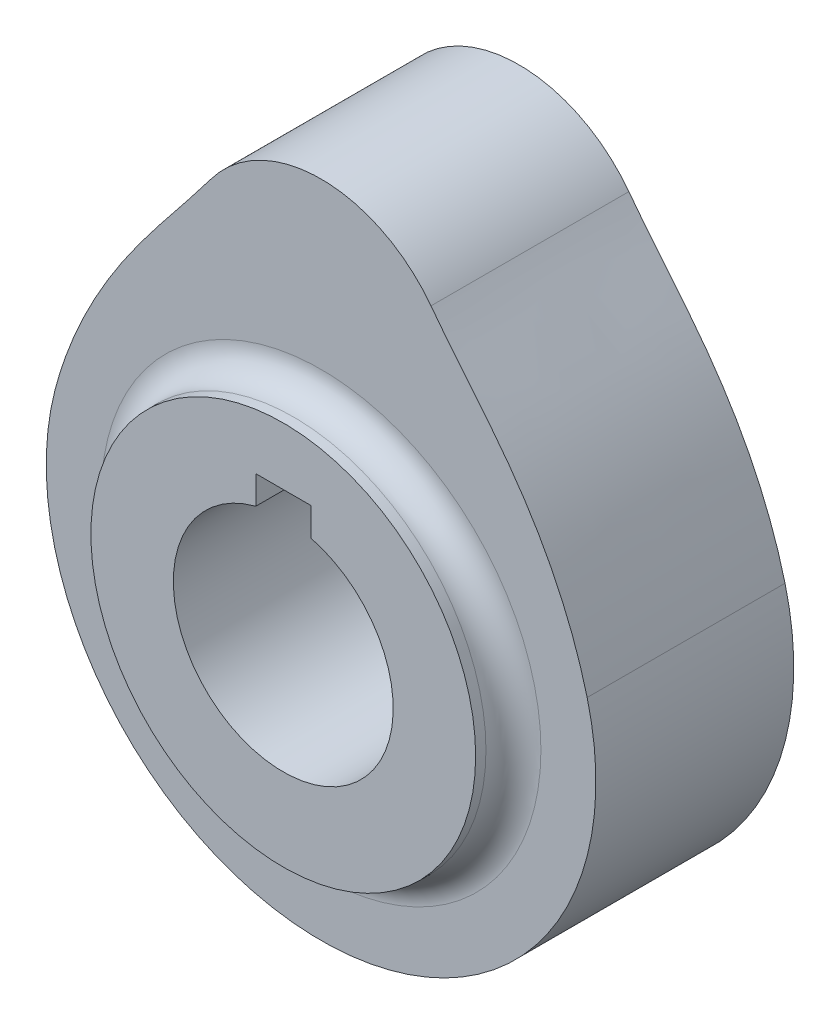
ISO-10303-21;
HEADER;
FILE_DESCRIPTION(('STEP AP214'),'2;1');
FILE_NAME('part.step','',(''),(''),'','','');
FILE_SCHEMA(('AUTOMOTIVE_DESIGN { 1 0 10303 214 1 1 1 1 }'));
ENDSEC;
DATA;
#1=APPLICATION_CONTEXT('core data for automotive mechanical design processes');
#2=APPLICATION_PROTOCOL_DEFINITION('international standard','automotive_design',2000,#1);
#3=PRODUCT_CONTEXT('',#1,'mechanical');
#4=PRODUCT('Part','Part','',(#3));
#5=PRODUCT_RELATED_PRODUCT_CATEGORY('part','',(#4));
#6=PRODUCT_DEFINITION_FORMATION('','',#4);
#7=PRODUCT_DEFINITION_CONTEXT('part definition',#1,'design');
#8=PRODUCT_DEFINITION('design','',#6,#7);
#9=PRODUCT_DEFINITION_SHAPE('','',#8);
#10=(LENGTH_UNIT() NAMED_UNIT(*) SI_UNIT(.MILLI.,.METRE.));
#11=(NAMED_UNIT(*) PLANE_ANGLE_UNIT() SI_UNIT($,.RADIAN.));
#12=(NAMED_UNIT(*) SI_UNIT($,.STERADIAN.) SOLID_ANGLE_UNIT());
#13=UNCERTAINTY_MEASURE_WITH_UNIT(LENGTH_MEASURE(1.E-05),#10,'distance_accuracy_value','');
#14=(GEOMETRIC_REPRESENTATION_CONTEXT(3) GLOBAL_UNCERTAINTY_ASSIGNED_CONTEXT((#13)) GLOBAL_UNIT_ASSIGNED_CONTEXT((#10,
#11,#12)) REPRESENTATION_CONTEXT('',''));
#15=CARTESIAN_POINT('',(0.,0.,0.));
#16=DIRECTION('',(0.,0.,1.));
#17=DIRECTION('',(1.,0.,0.));
#18=AXIS2_PLACEMENT_3D('',#15,#16,#17);
#19=CARTESIAN_POINT('',(-14.7328030515928,15.1288871038017,14.4));
#20=DIRECTION('',(0.,0.,1.));
#21=DIRECTION('',(1.,0.,0.));
#22=AXIS2_PLACEMENT_3D('',#19,#20,#21);
#23=PLANE('',#22);
#24=CARTESIAN_POINT('',(0.,0.,14.4));
#25=DIRECTION('',(0.,0.,1.));
#26=DIRECTION('',(1.,0.,0.));
#27=AXIS2_PLACEMENT_3D('',#24,#25,#26);
#28=CIRCLE('',#27,16.);
#29=CARTESIAN_POINT('',(16.,0.,14.4));
#30=VERTEX_POINT('',#29);
#31=EDGE_CURVE('E388',#30,#30,#28,.F.);
#32=ORIENTED_EDGE('',*,*,#31,.T.);
#33=EDGE_LOOP('',(#32));
#34=FACE_BOUND('',#33,.T.);
#35=CARTESIAN_POINT('',(-8.,24.,14.4));
#36=CARTESIAN_POINT('',(-9.88576361491472,21.485648513447,14.4));
#37=CARTESIAN_POINT('',(-14.7683469225071,15.8742453691268,14.4));
#38=CARTESIAN_POINT('',(-18.2976031188135,9.13368784532233,14.4));
#39=CARTESIAN_POINT('',(-19.3649167310371,5.,14.4));
#40=B_SPLINE_CURVE_WITH_KNOTS('',3,(#35,#36,#37,#38,#39),.UNSPECIFIED.,.F.,.F.,(4,1,4),(0.,
0.425985113809563,1.),.UNSPECIFIED.);
#41=CARTESIAN_POINT('',(-8.,24.,14.4));
#42=VERTEX_POINT('',#41);
#43=CARTESIAN_POINT('',(-19.3649167310371,5.,14.4));
#44=VERTEX_POINT('',#43);
#45=EDGE_CURVE('E161',#42,#44,#40,.T.);
#46=ORIENTED_EDGE('',*,*,#45,.T.);
#47=CARTESIAN_POINT('',(0.,0.,14.4));
#48=DIRECTION('',(0.,0.,1.));
#49=DIRECTION('',(-1.,0.,0.));
#50=AXIS2_PLACEMENT_3D('',#47,#48,#49);
#51=CIRCLE('',#50,20.);
#52=CARTESIAN_POINT('',(19.3649167310371,5.,14.4));
#53=VERTEX_POINT('',#52);
#54=EDGE_CURVE('E166',#44,#53,#51,.T.);
#55=ORIENTED_EDGE('',*,*,#54,.T.);
#56=CARTESIAN_POINT('',(19.3649167310371,5.,14.4));
#57=CARTESIAN_POINT('',(18.2287803940844,9.40023711203882,14.4));
#58=CARTESIAN_POINT('',(14.8352698556782,16.0327110814742,14.4));
#59=CARTESIAN_POINT('',(9.9746206812277,21.3671724250297,14.4));
#60=CARTESIAN_POINT('',(8.,24.,14.4));
#61=B_SPLINE_CURVE_WITH_KNOTS('',3,(#56,#57,#58,#59,#60),.UNSPECIFIED.,.F.,.F.,(4,1,4),(0.,
0.579854245128984,1.),.UNSPECIFIED.);
#62=CARTESIAN_POINT('',(8.,24.,14.4));
#63=VERTEX_POINT('',#62);
#64=EDGE_CURVE('E171',#53,#63,#61,.T.);
#65=ORIENTED_EDGE('',*,*,#64,.T.);
#66=CARTESIAN_POINT('',(0.,18.,14.4));
#67=DIRECTION('',(0.,0.,1.));
#68=DIRECTION('',(1.,0.,0.));
#69=AXIS2_PLACEMENT_3D('',#66,#67,#68);
#70=CIRCLE('',#69,10.);
#71=EDGE_CURVE('E60',#63,#42,#70,.T.);
#72=ORIENTED_EDGE('',*,*,#71,.T.);
#73=EDGE_LOOP('',(#46,#55,#65,#72));
#74=FACE_BOUND('',#73,.T.);
#75=ADVANCED_FACE('F36',(#34,#74),#23,.T.);
#76=CARTESIAN_POINT('',(-14.7328030515928,15.1288871038017,0.));
#77=DIRECTION('',(0.,0.,1.));
#78=DIRECTION('',(1.,0.,0.));
#79=AXIS2_PLACEMENT_3D('',#76,#77,#78);
#80=PLANE('',#79);
#81=CARTESIAN_POINT('',(0.,0.,0.));
#82=DIRECTION('',(0.,0.,1.));
#83=DIRECTION('',(1.,0.,0.));
#84=AXIS2_PLACEMENT_3D('',#81,#82,#83);
#85=CIRCLE('',#84,16.);
#86=CARTESIAN_POINT('',(16.,0.,0.));
#87=VERTEX_POINT('',#86);
#88=EDGE_CURVE('E381',#87,#87,#85,.T.);
#89=ORIENTED_EDGE('',*,*,#88,.T.);
#90=EDGE_LOOP('',(#89));
#91=FACE_BOUND('',#90,.T.);
#92=CARTESIAN_POINT('',(-8.,24.,0.));
#93=CARTESIAN_POINT('',(-9.88576361491472,21.485648513447,0.));
#94=CARTESIAN_POINT('',(-14.7683469225071,15.8742453691268,0.));
#95=CARTESIAN_POINT('',(-18.2976031188135,9.13368784532233,0.));
#96=CARTESIAN_POINT('',(-19.3649167310371,5.,0.));
#97=B_SPLINE_CURVE_WITH_KNOTS('',3,(#92,#93,#94,#95,#96),.UNSPECIFIED.,.F.,.F.,(4,1,4),(0.,
0.425985113809563,1.),.UNSPECIFIED.);
#98=CARTESIAN_POINT('',(-8.,24.,0.));
#99=VERTEX_POINT('',#98);
#100=CARTESIAN_POINT('',(-19.3649167310371,5.,0.));
#101=VERTEX_POINT('',#100);
#102=EDGE_CURVE('E143',#99,#101,#97,.T.);
#103=ORIENTED_EDGE('',*,*,#102,.F.);
#104=CARTESIAN_POINT('',(0.,18.,0.));
#105=DIRECTION('',(0.,0.,1.));
#106=DIRECTION('',(1.,0.,0.));
#107=AXIS2_PLACEMENT_3D('',#104,#105,#106);
#108=CIRCLE('',#107,10.);
#109=CARTESIAN_POINT('',(8.,24.,0.));
#110=VERTEX_POINT('',#109);
#111=EDGE_CURVE('E157',#110,#99,#108,.T.);
#112=ORIENTED_EDGE('',*,*,#111,.F.);
#113=CARTESIAN_POINT('',(19.3649167310371,5.,0.));
#114=CARTESIAN_POINT('',(18.2287803940844,9.40023711203882,0.));
#115=CARTESIAN_POINT('',(14.8352698556782,16.0327110814742,0.));
#116=CARTESIAN_POINT('',(9.9746206812277,21.3671724250297,0.));
#117=CARTESIAN_POINT('',(8.,24.,0.));
#118=B_SPLINE_CURVE_WITH_KNOTS('',3,(#113,#114,#115,#116,#117),.UNSPECIFIED.,.F.,.F.,(4,1,4),
(0.,0.579854245128984,1.),.UNSPECIFIED.);
#119=CARTESIAN_POINT('',(19.3649167310371,5.,0.));
#120=VERTEX_POINT('',#119);
#121=EDGE_CURVE('E153',#120,#110,#118,.T.);
#122=ORIENTED_EDGE('',*,*,#121,.F.);
#123=CARTESIAN_POINT('',(0.,0.,0.));
#124=DIRECTION('',(0.,0.,1.));
#125=DIRECTION('',(-1.,0.,0.));
#126=AXIS2_PLACEMENT_3D('',#123,#124,#125);
#127=CIRCLE('',#126,20.);
#128=EDGE_CURVE('E148',#101,#120,#127,.T.);
#129=ORIENTED_EDGE('',*,*,#128,.F.);
#130=EDGE_LOOP('',(#103,#112,#122,#129));
#131=FACE_BOUND('',#130,.T.);
#132=ADVANCED_FACE('F193',(#91,#131),#80,.F.);
#133=DIRECTION('',(0.,0.,-1.));
#134=VECTOR('',#133,1.);
#135=SURFACE_OF_LINEAR_EXTRUSION('',#40,#134);
#136=ORIENTED_EDGE('',*,*,#102,.T.);
#137=DIRECTION('',(0.,0.,-1.));
#138=VECTOR('',#137,1.);
#139=CARTESIAN_POINT('',(-19.3649167310371,5.,14.4));
#140=LINE('',#139,#138);
#141=EDGE_CURVE('E376',#44,#101,#140,.T.);
#142=ORIENTED_EDGE('',*,*,#141,.F.);
#143=ORIENTED_EDGE('',*,*,#45,.F.);
#144=DIRECTION('',(0.,0.,-1.));
#145=VECTOR('',#144,1.);
#146=CARTESIAN_POINT('',(-8.,24.,14.4));
#147=LINE('',#146,#145);
#148=EDGE_CURVE('E365',#42,#99,#147,.T.);
#149=ORIENTED_EDGE('',*,*,#148,.T.);
#150=EDGE_LOOP('',(#136,#142,#143,#149));
#151=FACE_BOUND('',#150,.T.);
#152=ADVANCED_FACE('F38',(#151),#135,.F.);
#153=CARTESIAN_POINT('',(0.,0.,14.4));
#154=DIRECTION('',(0.,0.,-1.));
#155=DIRECTION('',(-1.,0.,0.));
#156=AXIS2_PLACEMENT_3D('',#153,#154,#155);
#157=CYLINDRICAL_SURFACE('',#156,20.);
#158=ORIENTED_EDGE('',*,*,#128,.T.);
#159=DIRECTION('',(0.,0.,-1.));
#160=VECTOR('',#159,1.);
#161=CARTESIAN_POINT('',(19.3649167310371,5.,14.4));
#162=LINE('',#161,#160);
#163=EDGE_CURVE('E378',#53,#120,#162,.T.);
#164=ORIENTED_EDGE('',*,*,#163,.F.);
#165=ORIENTED_EDGE('',*,*,#54,.F.);
#166=ORIENTED_EDGE('',*,*,#141,.T.);
#167=EDGE_LOOP('',(#158,#164,#165,#166));
#168=FACE_BOUND('',#167,.T.);
#169=ADVANCED_FACE('F185',(#168),#157,.T.);
#170=DIRECTION('',(0.,0.,-1.));
#171=VECTOR('',#170,1.);
#172=SURFACE_OF_LINEAR_EXTRUSION('',#61,#171);
#173=ORIENTED_EDGE('',*,*,#121,.T.);
#174=DIRECTION('',(0.,0.,-1.));
#175=VECTOR('',#174,1.);
#176=CARTESIAN_POINT('',(8.,24.,14.4));
#177=LINE('',#176,#175);
#178=EDGE_CURVE('E368',#63,#110,#177,.T.);
#179=ORIENTED_EDGE('',*,*,#178,.F.);
#180=ORIENTED_EDGE('',*,*,#64,.F.);
#181=ORIENTED_EDGE('',*,*,#163,.T.);
#182=EDGE_LOOP('',(#173,#179,#180,#181));
#183=FACE_BOUND('',#182,.T.);
#184=ADVANCED_FACE('F181',(#183),#172,.F.);
#185=CARTESIAN_POINT('',(0.,18.,14.4));
#186=DIRECTION('',(0.,0.,-1.));
#187=DIRECTION('',(-1.,0.,0.));
#188=AXIS2_PLACEMENT_3D('',#185,#186,#187);
#189=CYLINDRICAL_SURFACE('',#188,10.);
#190=ORIENTED_EDGE('',*,*,#111,.T.);
#191=ORIENTED_EDGE('',*,*,#148,.F.);
#192=ORIENTED_EDGE('',*,*,#71,.F.);
#193=ORIENTED_EDGE('',*,*,#178,.T.);
#194=EDGE_LOOP('',(#190,#191,#192,#193));
#195=FACE_BOUND('',#194,.T.);
#196=ADVANCED_FACE('F184',(#195),#189,.T.);
#197=CARTESIAN_POINT('',(0.,0.,-2.85));
#198=DIRECTION('',(0.,0.,1.));
#199=DIRECTION('',(1.,0.,0.));
#200=AXIS2_PLACEMENT_3D('',#197,#198,#199);
#201=PLANE('',#200);
#202=DIRECTION('',(-1.,0.,0.));
#203=VECTOR('',#202,1.);
#204=CARTESIAN_POINT('',(-2.,9.8,-2.85));
#205=LINE('',#204,#203);
#206=CARTESIAN_POINT('',(2.,9.8,-2.85));
#207=VERTEX_POINT('',#206);
#208=CARTESIAN_POINT('',(-2.,9.8,-2.85));
#209=VERTEX_POINT('',#208);
#210=EDGE_CURVE('E118',#207,#209,#205,.T.);
#211=ORIENTED_EDGE('',*,*,#210,.T.);
#212=DIRECTION('',(0.,-1.,0.));
#213=VECTOR('',#212,1.);
#214=CARTESIAN_POINT('',(-2.,4.8,-2.85));
#215=LINE('',#214,#213);
#216=CARTESIAN_POINT('',(-2.,7.74596669241483,-2.85));
#217=VERTEX_POINT('',#216);
#218=EDGE_CURVE('E123',#209,#217,#215,.T.);
#219=ORIENTED_EDGE('',*,*,#218,.T.);
#220=CARTESIAN_POINT('',(0.,0.,-2.85));
#221=DIRECTION('',(0.,0.,1.));
#222=DIRECTION('',(1.,0.,0.));
#223=AXIS2_PLACEMENT_3D('',#220,#221,#222);
#224=CIRCLE('',#223,8.);
#225=CARTESIAN_POINT('',(2.,7.74596669241483,-2.85));
#226=VERTEX_POINT('',#225);
#227=EDGE_CURVE('E134',#217,#226,#224,.T.);
#228=ORIENTED_EDGE('',*,*,#227,.T.);
#229=DIRECTION('',(0.,1.,0.));
#230=VECTOR('',#229,1.);
#231=CARTESIAN_POINT('',(2.,4.8,-2.85));
#232=LINE('',#231,#230);
#233=EDGE_CURVE('E52',#226,#207,#232,.T.);
#234=ORIENTED_EDGE('',*,*,#233,.T.);
#235=EDGE_LOOP('',(#211,#219,#228,#234));
#236=FACE_BOUND('',#235,.T.);
#237=CARTESIAN_POINT('',(0.,0.,-2.85));
#238=DIRECTION('',(0.,0.,1.));
#239=DIRECTION('',(1.,0.,0.));
#240=AXIS2_PLACEMENT_3D('',#237,#238,#239);
#241=CIRCLE('',#240,14.);
#242=CARTESIAN_POINT('',(14.,0.,-2.85));
#243=VERTEX_POINT('',#242);
#244=EDGE_CURVE('E137',#243,#243,#241,.T.);
#245=ORIENTED_EDGE('',*,*,#244,.F.);
#246=EDGE_LOOP('',(#245));
#247=FACE_BOUND('',#246,.T.);
#248=ADVANCED_FACE('F212',(#236,#247),#201,.F.);
#249=CARTESIAN_POINT('',(0.,0.,17.15));
#250=DIRECTION('',(0.,0.,-1.));
#251=DIRECTION('',(-1.,0.,0.));
#252=AXIS2_PLACEMENT_3D('',#249,#250,#251);
#253=CYLINDRICAL_SURFACE('',#252,14.);
#254=CARTESIAN_POINT('',(0.,0.,-2.));
#255=DIRECTION('',(0.,0.,1.));
#256=DIRECTION('',(1.,0.,0.));
#257=AXIS2_PLACEMENT_3D('',#254,#255,#256);
#258=CIRCLE('',#257,14.);
#259=CARTESIAN_POINT('',(14.,0.,-2.));
#260=VERTEX_POINT('',#259);
#261=EDGE_CURVE('E377',#260,#260,#258,.F.);
#262=ORIENTED_EDGE('',*,*,#261,.T.);
#263=EDGE_LOOP('',(#262));
#264=FACE_BOUND('',#263,.T.);
#265=ORIENTED_EDGE('',*,*,#244,.T.);
#266=EDGE_LOOP('',(#265));
#267=FACE_BOUND('',#266,.T.);
#268=ADVANCED_FACE('F207',(#264,#267),#253,.T.);
#269=CARTESIAN_POINT('',(0.,0.,16.4));
#270=DIRECTION('',(0.,0.,1.));
#271=DIRECTION('',(1.,0.,0.));
#272=AXIS2_PLACEMENT_3D('',#269,#270,#271);
#273=CIRCLE('',#272,14.);
#274=CARTESIAN_POINT('',(14.,0.,16.4));
#275=VERTEX_POINT('',#274);
#276=EDGE_CURVE('E390',#275,#275,#273,.T.);
#277=ORIENTED_EDGE('',*,*,#276,.T.);
#278=EDGE_LOOP('',(#277));
#279=FACE_BOUND('',#278,.T.);
#280=CARTESIAN_POINT('',(0.,0.,17.15));
#281=DIRECTION('',(0.,0.,1.));
#282=DIRECTION('',(1.,0.,0.));
#283=AXIS2_PLACEMENT_3D('',#280,#281,#282);
#284=CIRCLE('',#283,14.);
#285=CARTESIAN_POINT('',(14.,0.,17.15));
#286=VERTEX_POINT('',#285);
#287=EDGE_CURVE('E140',#286,#286,#284,.T.);
#288=ORIENTED_EDGE('',*,*,#287,.F.);
#289=EDGE_LOOP('',(#288));
#290=FACE_BOUND('',#289,.T.);
#291=ADVANCED_FACE('F204',(#279,#290),#253,.T.);
#292=CARTESIAN_POINT('',(0.,0.,17.15));
#293=DIRECTION('',(0.,0.,1.));
#294=DIRECTION('',(1.,0.,0.));
#295=AXIS2_PLACEMENT_3D('',#292,#293,#294);
#296=PLANE('',#295);
#297=DIRECTION('',(0.,-1.,0.));
#298=VECTOR('',#297,1.);
#299=CARTESIAN_POINT('',(-2.,4.8,17.15));
#300=LINE('',#299,#298);
#301=CARTESIAN_POINT('',(-2.,9.8,17.15));
#302=VERTEX_POINT('',#301);
#303=CARTESIAN_POINT('',(-2.,7.74596669241483,17.15));
#304=VERTEX_POINT('',#303);
#305=EDGE_CURVE('E111',#302,#304,#300,.T.);
#306=ORIENTED_EDGE('',*,*,#305,.F.);
#307=DIRECTION('',(-1.,0.,0.));
#308=VECTOR('',#307,1.);
#309=CARTESIAN_POINT('',(-2.,9.8,17.15));
#310=LINE('',#309,#308);
#311=CARTESIAN_POINT('',(2.,9.8,17.15));
#312=VERTEX_POINT('',#311);
#313=EDGE_CURVE('E110',#312,#302,#310,.T.);
#314=ORIENTED_EDGE('',*,*,#313,.F.);
#315=DIRECTION('',(0.,1.,0.));
#316=VECTOR('',#315,1.);
#317=CARTESIAN_POINT('',(2.,4.8,17.15));
#318=LINE('',#317,#316);
#319=CARTESIAN_POINT('',(2.,7.74596669241483,17.15));
#320=VERTEX_POINT('',#319);
#321=EDGE_CURVE('E101',#320,#312,#318,.T.);
#322=ORIENTED_EDGE('',*,*,#321,.F.);
#323=CARTESIAN_POINT('',(0.,0.,17.15));
#324=DIRECTION('',(0.,0.,1.));
#325=DIRECTION('',(1.,0.,0.));
#326=AXIS2_PLACEMENT_3D('',#323,#324,#325);
#327=CIRCLE('',#326,8.);
#328=EDGE_CURVE('E131',#304,#320,#327,.T.);
#329=ORIENTED_EDGE('',*,*,#328,.F.);
#330=EDGE_LOOP('',(#306,#314,#322,#329));
#331=FACE_BOUND('',#330,.T.);
#332=ORIENTED_EDGE('',*,*,#287,.T.);
#333=EDGE_LOOP('',(#332));
#334=FACE_BOUND('',#333,.T.);
#335=ADVANCED_FACE('F121',(#331,#334),#296,.T.);
#336=CARTESIAN_POINT('',(0.,0.,-2.));
#337=DIRECTION('',(0.,0.,1.));
#338=DIRECTION('',(1.,0.,0.));
#339=AXIS2_PLACEMENT_3D('',#336,#337,#338);
#340=TOROIDAL_SURFACE('',#339,16.,2.);
#341=ORIENTED_EDGE('',*,*,#88,.F.);
#342=EDGE_LOOP('',(#341));
#343=FACE_BOUND('',#342,.T.);
#344=ORIENTED_EDGE('',*,*,#261,.F.);
#345=EDGE_LOOP('',(#344));
#346=FACE_BOUND('',#345,.T.);
#347=ADVANCED_FACE('F211',(#343,#346),#340,.F.);
#348=CARTESIAN_POINT('',(0.,0.,16.4));
#349=DIRECTION('',(0.,0.,1.));
#350=DIRECTION('',(1.,0.,0.));
#351=AXIS2_PLACEMENT_3D('',#348,#349,#350);
#352=TOROIDAL_SURFACE('',#351,16.,2.);
#353=ORIENTED_EDGE('',*,*,#276,.F.);
#354=EDGE_LOOP('',(#353));
#355=FACE_BOUND('',#354,.T.);
#356=ORIENTED_EDGE('',*,*,#31,.F.);
#357=EDGE_LOOP('',(#356));
#358=FACE_BOUND('',#357,.T.);
#359=ADVANCED_FACE('F218',(#355,#358),#352,.F.);
#360=CARTESIAN_POINT('',(0.,0.,-2.85));
#361=DIRECTION('',(0.,0.,1.));
#362=DIRECTION('',(1.,0.,0.));
#363=AXIS2_PLACEMENT_3D('',#360,#361,#362);
#364=CYLINDRICAL_SURFACE('',#363,8.);
#365=ORIENTED_EDGE('',*,*,#227,.F.);
#366=DIRECTION('',(0.,0.,1.));
#367=VECTOR('',#366,1.);
#368=CARTESIAN_POINT('',(-2.,7.74596669241483,-2.85));
#369=LINE('',#368,#367);
#370=EDGE_CURVE('E11',#217,#304,#369,.T.);
#371=ORIENTED_EDGE('',*,*,#370,.T.);
#372=ORIENTED_EDGE('',*,*,#328,.T.);
#373=DIRECTION('',(0.,0.,1.));
#374=VECTOR('',#373,1.);
#375=CARTESIAN_POINT('',(2.,7.74596669241483,-2.85));
#376=LINE('',#375,#374);
#377=EDGE_CURVE('E45',#320,#226,#376,.F.);
#378=ORIENTED_EDGE('',*,*,#377,.T.);
#379=EDGE_LOOP('',(#365,#371,#372,#378));
#380=FACE_BOUND('',#379,.T.);
#381=ADVANCED_FACE('F222',(#380),#364,.F.);
#382=CARTESIAN_POINT('',(-2.,4.8,-2.85));
#383=DIRECTION('',(-1.,0.,0.));
#384=DIRECTION('',(0.,0.,1.));
#385=AXIS2_PLACEMENT_3D('',#382,#383,#384);
#386=PLANE('',#385);
#387=ORIENTED_EDGE('',*,*,#218,.F.);
#388=DIRECTION('',(0.,0.,1.));
#389=VECTOR('',#388,1.);
#390=CARTESIAN_POINT('',(-2.,9.8,-2.85));
#391=LINE('',#390,#389);
#392=EDGE_CURVE('E119',#209,#302,#391,.T.);
#393=ORIENTED_EDGE('',*,*,#392,.T.);
#394=ORIENTED_EDGE('',*,*,#305,.T.);
#395=ORIENTED_EDGE('',*,*,#370,.F.);
#396=EDGE_LOOP('',(#387,#393,#394,#395));
#397=FACE_BOUND('',#396,.T.);
#398=ADVANCED_FACE('F226',(#397),#386,.F.);
#399=CARTESIAN_POINT('',(2.,4.8,-2.85));
#400=DIRECTION('',(1.,0.,0.));
#401=DIRECTION('',(0.,0.,-1.));
#402=AXIS2_PLACEMENT_3D('',#399,#400,#401);
#403=PLANE('',#402);
#404=ORIENTED_EDGE('',*,*,#321,.T.);
#405=DIRECTION('',(0.,0.,1.));
#406=VECTOR('',#405,1.);
#407=CARTESIAN_POINT('',(2.,9.8,-2.85));
#408=LINE('',#407,#406);
#409=EDGE_CURVE('E104',#207,#312,#408,.T.);
#410=ORIENTED_EDGE('',*,*,#409,.F.);
#411=ORIENTED_EDGE('',*,*,#233,.F.);
#412=ORIENTED_EDGE('',*,*,#377,.F.);
#413=EDGE_LOOP('',(#404,#410,#411,#412));
#414=FACE_BOUND('',#413,.T.);
#415=ADVANCED_FACE('F103',(#414),#403,.F.);
#416=CARTESIAN_POINT('',(-2.,9.8,-2.85));
#417=DIRECTION('',(0.,1.,0.));
#418=DIRECTION('',(0.,0.,1.));
#419=AXIS2_PLACEMENT_3D('',#416,#417,#418);
#420=PLANE('',#419);
#421=ORIENTED_EDGE('',*,*,#313,.T.);
#422=ORIENTED_EDGE('',*,*,#392,.F.);
#423=ORIENTED_EDGE('',*,*,#210,.F.);
#424=ORIENTED_EDGE('',*,*,#409,.T.);
#425=EDGE_LOOP('',(#421,#422,#423,#424));
#426=FACE_BOUND('',#425,.T.);
#427=ADVANCED_FACE('F115',(#426),#420,.F.);
#428=CLOSED_SHELL('',(#75,#132,#152,#169,#184,#196,#248,#268,#291,#335,#347,#359,#381,#398,#415,#427));
#429=MANIFOLD_SOLID_BREP('B2',#428);
#430=ADVANCED_BREP_SHAPE_REPRESENTATION('',(#18,#429),#14);
#431=SHAPE_DEFINITION_REPRESENTATION(#9,#430);
ENDSEC;
END-ISO-10303-21;
